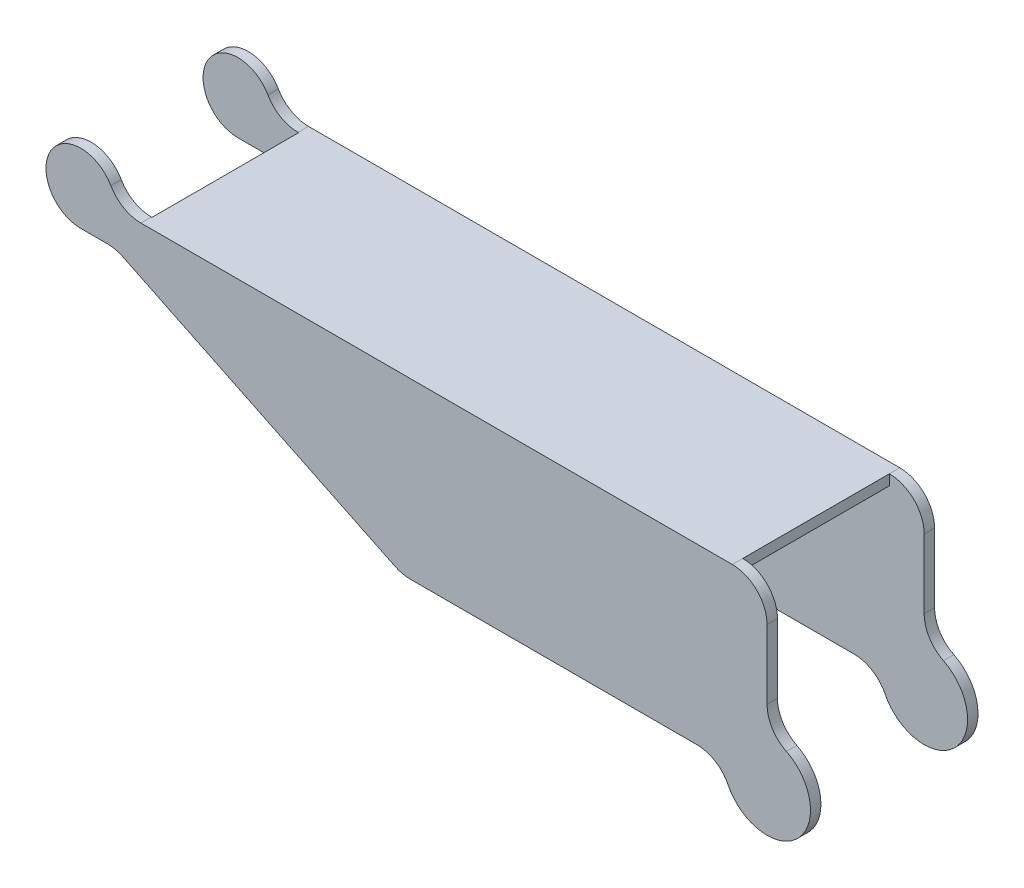
ISO-10303-21;
HEADER;
FILE_DESCRIPTION(('STEP AP214'),'2;1');
FILE_NAME('part.step','',(''),(''),'','','');
FILE_SCHEMA(('AUTOMOTIVE_DESIGN { 1 0 10303 214 1 1 1 1 }'));
ENDSEC;
DATA;
#1=APPLICATION_CONTEXT('core data for automotive mechanical design processes');
#2=APPLICATION_PROTOCOL_DEFINITION('international standard','automotive_design',2000,#1);
#3=PRODUCT_CONTEXT('',#1,'mechanical');
#4=PRODUCT('Part','Part','',(#3));
#5=PRODUCT_RELATED_PRODUCT_CATEGORY('part','',(#4));
#6=PRODUCT_DEFINITION_FORMATION('','',#4);
#7=PRODUCT_DEFINITION_CONTEXT('part definition',#1,'design');
#8=PRODUCT_DEFINITION('design','',#6,#7);
#9=PRODUCT_DEFINITION_SHAPE('','',#8);
#10=(LENGTH_UNIT() NAMED_UNIT(*) SI_UNIT(.MILLI.,.METRE.));
#11=(NAMED_UNIT(*) PLANE_ANGLE_UNIT() SI_UNIT($,.RADIAN.));
#12=(NAMED_UNIT(*) SI_UNIT($,.STERADIAN.) SOLID_ANGLE_UNIT());
#13=UNCERTAINTY_MEASURE_WITH_UNIT(LENGTH_MEASURE(1.E-05),#10,'distance_accuracy_value','');
#14=(GEOMETRIC_REPRESENTATION_CONTEXT(3) GLOBAL_UNCERTAINTY_ASSIGNED_CONTEXT((#13)) GLOBAL_UNIT_ASSIGNED_CONTEXT((#10,
#11,#12)) REPRESENTATION_CONTEXT('',''));
#15=CARTESIAN_POINT('',(0.,0.,0.));
#16=DIRECTION('',(0.,0.,1.));
#17=DIRECTION('',(1.,0.,0.));
#18=AXIS2_PLACEMENT_3D('',#15,#16,#17);
#19=CARTESIAN_POINT('',(78.5893556292536,-35.,3.));
#20=DIRECTION('',(0.,0.,-1.));
#21=DIRECTION('',(-1.,0.,0.));
#22=AXIS2_PLACEMENT_3D('',#19,#20,#21);
#23=CYLINDRICAL_SURFACE('',#22,10.);
#24=CARTESIAN_POINT('',(78.5893556292536,-35.,0.));
#25=DIRECTION('',(0.,0.,-1.));
#26=DIRECTION('',(-1.,0.,0.));
#27=AXIS2_PLACEMENT_3D('',#24,#25,#26);
#28=CIRCLE('',#27,10.);
#29=CARTESIAN_POINT('',(78.5893556292536,-25.,0.));
#30=VERTEX_POINT('',#29);
#31=CARTESIAN_POINT('',(87.5474197940298,-30.5555555555556,0.));
#32=VERTEX_POINT('',#31);
#33=EDGE_CURVE('E361',#30,#32,#28,.T.);
#34=ORIENTED_EDGE('',*,*,#33,.T.);
#35=DIRECTION('',(0.,0.,-1.));
#36=VECTOR('',#35,1.);
#37=CARTESIAN_POINT('',(87.5474197940298,-30.5555555555556,3.));
#38=LINE('',#37,#36);
#39=CARTESIAN_POINT('',(87.5474197940298,-30.5555555555556,3.));
#40=VERTEX_POINT('',#39);
#41=EDGE_CURVE('E457',#40,#32,#38,.T.);
#42=ORIENTED_EDGE('',*,*,#41,.F.);
#43=CARTESIAN_POINT('',(78.5893556292536,-35.,3.));
#44=DIRECTION('',(0.,0.,-1.));
#45=DIRECTION('',(-1.,0.,0.));
#46=AXIS2_PLACEMENT_3D('',#43,#44,#45);
#47=CIRCLE('',#46,10.);
#48=CARTESIAN_POINT('',(78.5893556292536,-25.,3.));
#49=VERTEX_POINT('',#48);
#50=EDGE_CURVE('E367',#49,#40,#47,.T.);
#51=ORIENTED_EDGE('',*,*,#50,.F.);
#52=DIRECTION('',(0.,0.,-1.));
#53=VECTOR('',#52,1.);
#54=CARTESIAN_POINT('',(78.5893556292536,-25.,3.));
#55=LINE('',#54,#53);
#56=EDGE_CURVE('E395',#49,#30,#55,.T.);
#57=ORIENTED_EDGE('',*,*,#56,.T.);
#58=EDGE_LOOP('',(#34,#42,#51,#57));
#59=FACE_BOUND('',#58,.T.);
#60=ADVANCED_FACE('F43',(#59),#23,.F.);
#61=CARTESIAN_POINT('',(98.745,-25.,3.));
#62=DIRECTION('',(0.,0.,-1.));
#63=DIRECTION('',(-1.,0.,0.));
#64=AXIS2_PLACEMENT_3D('',#61,#62,#63);
#65=CYLINDRICAL_SURFACE('',#64,12.5);
#66=CARTESIAN_POINT('',(98.745,-25.,0.));
#67=DIRECTION('',(0.,0.,1.));
#68=DIRECTION('',(1.,0.,0.));
#69=AXIS2_PLACEMENT_3D('',#66,#67,#68);
#70=CIRCLE('',#69,12.5);
#71=CARTESIAN_POINT('',(104.300555555556,-13.8024197940298,0.));
#72=VERTEX_POINT('',#71);
#73=EDGE_CURVE('E398',#32,#72,#70,.T.);
#74=ORIENTED_EDGE('',*,*,#73,.T.);
#75=DIRECTION('',(0.,0.,-1.));
#76=VECTOR('',#75,1.);
#77=CARTESIAN_POINT('',(104.300555555556,-13.8024197940298,3.));
#78=LINE('',#77,#76);
#79=CARTESIAN_POINT('',(104.300555555556,-13.8024197940298,3.));
#80=VERTEX_POINT('',#79);
#81=EDGE_CURVE('E454',#80,#72,#78,.T.);
#82=ORIENTED_EDGE('',*,*,#81,.F.);
#83=CARTESIAN_POINT('',(98.745,-25.,3.));
#84=DIRECTION('',(0.,0.,1.));
#85=DIRECTION('',(1.,0.,0.));
#86=AXIS2_PLACEMENT_3D('',#83,#84,#85);
#87=CIRCLE('',#86,12.5);
#88=EDGE_CURVE('E370',#40,#80,#87,.T.);
#89=ORIENTED_EDGE('',*,*,#88,.F.);
#90=ORIENTED_EDGE('',*,*,#41,.T.);
#91=EDGE_LOOP('',(#74,#82,#89,#90));
#92=FACE_BOUND('',#91,.T.);
#93=ADVANCED_FACE('F533',(#92),#65,.T.);
#94=CARTESIAN_POINT('',(108.745,-4.84435562925363,3.));
#95=DIRECTION('',(0.,0.,-1.));
#96=DIRECTION('',(-1.,0.,0.));
#97=AXIS2_PLACEMENT_3D('',#94,#95,#96);
#98=CYLINDRICAL_SURFACE('',#97,10.);
#99=CARTESIAN_POINT('',(108.745,-4.84435562925363,0.));
#100=DIRECTION('',(0.,0.,-1.));
#101=DIRECTION('',(-1.,0.,0.));
#102=AXIS2_PLACEMENT_3D('',#99,#100,#101);
#103=CIRCLE('',#102,10.);
#104=CARTESIAN_POINT('',(98.745,-4.84435562925363,0.));
#105=VERTEX_POINT('',#104);
#106=EDGE_CURVE('E400',#72,#105,#103,.T.);
#107=ORIENTED_EDGE('',*,*,#106,.T.);
#108=DIRECTION('',(0.,0.,-1.));
#109=VECTOR('',#108,1.);
#110=CARTESIAN_POINT('',(98.745,-4.84435562925363,3.));
#111=LINE('',#110,#109);
#112=CARTESIAN_POINT('',(98.745,-4.84435562925363,3.));
#113=VERTEX_POINT('',#112);
#114=EDGE_CURVE('E451',#113,#105,#111,.T.);
#115=ORIENTED_EDGE('',*,*,#114,.F.);
#116=CARTESIAN_POINT('',(108.745,-4.84435562925363,3.));
#117=DIRECTION('',(0.,0.,-1.));
#118=DIRECTION('',(-1.,0.,0.));
#119=AXIS2_PLACEMENT_3D('',#116,#117,#118);
#120=CIRCLE('',#119,10.);
#121=EDGE_CURVE('E373',#80,#113,#120,.T.);
#122=ORIENTED_EDGE('',*,*,#121,.F.);
#123=ORIENTED_EDGE('',*,*,#81,.T.);
#124=EDGE_LOOP('',(#107,#115,#122,#123));
#125=FACE_BOUND('',#124,.T.);
#126=ADVANCED_FACE('F530',(#125),#98,.F.);
#127=CARTESIAN_POINT('',(98.745,-4.84435562925363,3.));
#128=DIRECTION('',(-1.,0.,0.));
#129=DIRECTION('',(0.,0.,1.));
#130=AXIS2_PLACEMENT_3D('',#127,#128,#129);
#131=PLANE('',#130);
#132=DIRECTION('',(0.,1.,0.));
#133=VECTOR('',#132,1.);
#134=CARTESIAN_POINT('',(98.745,-4.84435562925363,0.));
#135=LINE('',#134,#133);
#136=CARTESIAN_POINT('',(98.745,14.9999999999999,0.));
#137=VERTEX_POINT('',#136);
#138=EDGE_CURVE('E402',#105,#137,#135,.T.);
#139=ORIENTED_EDGE('',*,*,#138,.T.);
#140=DIRECTION('',(0.,0.,-1.));
#141=VECTOR('',#140,1.);
#142=CARTESIAN_POINT('',(98.745,14.9999999999999,3.));
#143=LINE('',#142,#141);
#144=CARTESIAN_POINT('',(98.745,14.9999999999999,3.));
#145=VERTEX_POINT('',#144);
#146=EDGE_CURVE('E448',#145,#137,#143,.T.);
#147=ORIENTED_EDGE('',*,*,#146,.F.);
#148=DIRECTION('',(0.,1.,0.));
#149=VECTOR('',#148,1.);
#150=CARTESIAN_POINT('',(98.745,-4.84435562925363,3.));
#151=LINE('',#150,#149);
#152=EDGE_CURVE('E375',#113,#145,#151,.T.);
#153=ORIENTED_EDGE('',*,*,#152,.F.);
#154=ORIENTED_EDGE('',*,*,#114,.T.);
#155=EDGE_LOOP('',(#139,#147,#153,#154));
#156=FACE_BOUND('',#155,.T.);
#157=ADVANCED_FACE('F525',(#156),#131,.F.);
#158=CARTESIAN_POINT('',(88.745,15.,3.));
#159=DIRECTION('',(0.,0.,-1.));
#160=DIRECTION('',(-1.,0.,0.));
#161=AXIS2_PLACEMENT_3D('',#158,#159,#160);
#162=CYLINDRICAL_SURFACE('',#161,10.);
#163=CARTESIAN_POINT('',(88.745,15.,0.));
#164=DIRECTION('',(0.,0.,1.));
#165=DIRECTION('',(-1.,0.,0.));
#166=AXIS2_PLACEMENT_3D('',#163,#164,#165);
#167=CIRCLE('',#166,10.);
#168=CARTESIAN_POINT('',(88.7449999999999,25.,0.));
#169=VERTEX_POINT('',#168);
#170=EDGE_CURVE('E404',#137,#169,#167,.T.);
#171=ORIENTED_EDGE('',*,*,#170,.T.);
#172=DIRECTION('',(0.,0.,-1.));
#173=VECTOR('',#172,1.);
#174=CARTESIAN_POINT('',(88.7449999999999,25.,3.));
#175=LINE('',#174,#173);
#176=CARTESIAN_POINT('',(88.7449999999999,25.,3.));
#177=VERTEX_POINT('',#176);
#178=EDGE_CURVE('E445',#177,#169,#175,.T.);
#179=ORIENTED_EDGE('',*,*,#178,.F.);
#180=CARTESIAN_POINT('',(88.745,15.,3.));
#181=DIRECTION('',(0.,0.,1.));
#182=DIRECTION('',(-1.,0.,0.));
#183=AXIS2_PLACEMENT_3D('',#180,#181,#182);
#184=CIRCLE('',#183,10.);
#185=EDGE_CURVE('E377',#145,#177,#184,.T.);
#186=ORIENTED_EDGE('',*,*,#185,.F.);
#187=ORIENTED_EDGE('',*,*,#146,.T.);
#188=EDGE_LOOP('',(#171,#179,#186,#187));
#189=FACE_BOUND('',#188,.T.);
#190=ADVANCED_FACE('F520',(#189),#162,.T.);
#191=CARTESIAN_POINT('',(-81.4244919243112,25.,3.));
#192=DIRECTION('',(0.,-1.,0.));
#193=DIRECTION('',(0.,0.,-1.));
#194=AXIS2_PLACEMENT_3D('',#191,#192,#193);
#195=PLANE('',#194);
#196=DIRECTION('',(0.,0.,-1.));
#197=VECTOR('',#196,1.);
#198=CARTESIAN_POINT('',(88.7449999999999,25.,-45.2));
#199=LINE('',#198,#197);
#200=CARTESIAN_POINT('',(88.7449999999999,25.,-42.2));
#201=VERTEX_POINT('',#200);
#202=EDGE_CURVE('E355',#169,#201,#199,.T.);
#203=ORIENTED_EDGE('',*,*,#202,.T.);
#204=DIRECTION('',(0.,0.,1.));
#205=VECTOR('',#204,1.);
#206=CARTESIAN_POINT('',(88.7449999999999,25.,-45.2));
#207=LINE('',#206,#205);
#208=CARTESIAN_POINT('',(88.7449999999999,25.,-45.2));
#209=VERTEX_POINT('',#208);
#210=EDGE_CURVE('E344',#209,#201,#207,.T.);
#211=ORIENTED_EDGE('',*,*,#210,.F.);
#212=DIRECTION('',(-1.,0.,0.));
#213=VECTOR('',#212,1.);
#214=CARTESIAN_POINT('',(-81.2550000000001,25.,-45.2));
#215=LINE('',#214,#213);
#216=CARTESIAN_POINT('',(-81.4244919243112,25.,-45.2));
#217=VERTEX_POINT('',#216);
#218=EDGE_CURVE('E364',#209,#217,#215,.T.);
#219=ORIENTED_EDGE('',*,*,#218,.T.);
#220=DIRECTION('',(0.,0.,1.));
#221=VECTOR('',#220,1.);
#222=CARTESIAN_POINT('',(-81.4244919243112,25.,-45.2));
#223=LINE('',#222,#221);
#224=CARTESIAN_POINT('',(-81.4244919243112,25.,-42.2));
#225=VERTEX_POINT('',#224);
#226=EDGE_CURVE('E341',#217,#225,#223,.T.);
#227=ORIENTED_EDGE('',*,*,#226,.T.);
#228=DIRECTION('',(-1.,0.,0.));
#229=VECTOR('',#228,1.);
#230=CARTESIAN_POINT('',(-81.4244919243112,25.,-42.2));
#231=LINE('',#230,#229);
#232=CARTESIAN_POINT('',(-81.2550000000001,25.,-42.2));
#233=VERTEX_POINT('',#232);
#234=EDGE_CURVE('E303',#233,#225,#231,.T.);
#235=ORIENTED_EDGE('',*,*,#234,.F.);
#236=DIRECTION('',(0.,0.,1.));
#237=VECTOR('',#236,1.);
#238=CARTESIAN_POINT('',(-81.2550000000001,25.,-45.2));
#239=LINE('',#238,#237);
#240=CARTESIAN_POINT('',(-81.2550000000001,25.,0.));
#241=VERTEX_POINT('',#240);
#242=EDGE_CURVE('E64',#233,#241,#239,.T.);
#243=ORIENTED_EDGE('',*,*,#242,.T.);
#244=DIRECTION('',(-1.,0.,0.));
#245=VECTOR('',#244,1.);
#246=CARTESIAN_POINT('',(-81.4244919243112,25.,0.));
#247=LINE('',#246,#245);
#248=CARTESIAN_POINT('',(-81.4244919243112,25.,0.));
#249=VERTEX_POINT('',#248);
#250=EDGE_CURVE('E407',#241,#249,#247,.T.);
#251=ORIENTED_EDGE('',*,*,#250,.T.);
#252=DIRECTION('',(0.,0.,-1.));
#253=VECTOR('',#252,1.);
#254=CARTESIAN_POINT('',(-81.4244919243112,25.,3.));
#255=LINE('',#254,#253);
#256=CARTESIAN_POINT('',(-81.4244919243112,25.,3.));
#257=VERTEX_POINT('',#256);
#258=EDGE_CURVE('E442',#257,#249,#255,.T.);
#259=ORIENTED_EDGE('',*,*,#258,.F.);
#260=DIRECTION('',(-1.,0.,0.));
#261=VECTOR('',#260,1.);
#262=CARTESIAN_POINT('',(-81.4244919243112,25.,3.));
#263=LINE('',#262,#261);
#264=EDGE_CURVE('E379',#177,#257,#263,.T.);
#265=ORIENTED_EDGE('',*,*,#264,.F.);
#266=ORIENTED_EDGE('',*,*,#178,.T.);
#267=EDGE_LOOP('',(#203,#211,#219,#227,#235,#243,#251,#259,#265,#266));
#268=FACE_BOUND('',#267,.T.);
#269=ADVANCED_FACE('F483',(#268),#195,.F.);
#270=CARTESIAN_POINT('',(-81.4244919243112,35.,3.));
#271=DIRECTION('',(0.,0.,-1.));
#272=DIRECTION('',(-1.,0.,0.));
#273=AXIS2_PLACEMENT_3D('',#270,#271,#272);
#274=CYLINDRICAL_SURFACE('',#273,10.);
#275=CARTESIAN_POINT('',(-81.4244919243112,35.,0.));
#276=DIRECTION('',(0.,0.,-1.));
#277=DIRECTION('',(-1.,0.,0.));
#278=AXIS2_PLACEMENT_3D('',#275,#276,#277);
#279=CIRCLE('',#278,10.);
#280=CARTESIAN_POINT('',(-90.0847459621556,30.,0.));
#281=VERTEX_POINT('',#280);
#282=EDGE_CURVE('E409',#249,#281,#279,.T.);
#283=ORIENTED_EDGE('',*,*,#282,.T.);
#284=DIRECTION('',(0.,0.,-1.));
#285=VECTOR('',#284,1.);
#286=CARTESIAN_POINT('',(-90.0847459621556,30.,3.));
#287=LINE('',#286,#285);
#288=CARTESIAN_POINT('',(-90.0847459621556,30.,3.));
#289=VERTEX_POINT('',#288);
#290=EDGE_CURVE('E439',#289,#281,#287,.T.);
#291=ORIENTED_EDGE('',*,*,#290,.F.);
#292=CARTESIAN_POINT('',(-81.4244919243112,35.,3.));
#293=DIRECTION('',(0.,0.,-1.));
#294=DIRECTION('',(-1.,0.,0.));
#295=AXIS2_PLACEMENT_3D('',#292,#293,#294);
#296=CIRCLE('',#295,10.);
#297=EDGE_CURVE('E381',#257,#289,#296,.T.);
#298=ORIENTED_EDGE('',*,*,#297,.F.);
#299=ORIENTED_EDGE('',*,*,#258,.T.);
#300=EDGE_LOOP('',(#283,#291,#298,#299));
#301=FACE_BOUND('',#300,.T.);
#302=ADVANCED_FACE('F571',(#301),#274,.F.);
#303=CARTESIAN_POINT('',(-98.745,25.,3.));
#304=DIRECTION('',(0.,0.,-1.));
#305=DIRECTION('',(-1.,0.,0.));
#306=AXIS2_PLACEMENT_3D('',#303,#304,#305);
#307=CYLINDRICAL_SURFACE('',#306,9.99999999999999);
#308=CARTESIAN_POINT('',(-98.745,25.,0.));
#309=DIRECTION('',(0.,0.,1.));
#310=DIRECTION('',(1.,0.,0.));
#311=AXIS2_PLACEMENT_3D('',#308,#309,#310);
#312=CIRCLE('',#311,9.99999999999999);
#313=CARTESIAN_POINT('',(-98.745,15.,0.));
#314=VERTEX_POINT('',#313);
#315=EDGE_CURVE('E411',#281,#314,#312,.T.);
#316=ORIENTED_EDGE('',*,*,#315,.T.);
#317=DIRECTION('',(0.,0.,-1.));
#318=VECTOR('',#317,1.);
#319=CARTESIAN_POINT('',(-98.745,15.,3.));
#320=LINE('',#319,#318);
#321=CARTESIAN_POINT('',(-98.745,15.,3.));
#322=VERTEX_POINT('',#321);
#323=EDGE_CURVE('E436',#322,#314,#320,.T.);
#324=ORIENTED_EDGE('',*,*,#323,.F.);
#325=CARTESIAN_POINT('',(-98.745,25.,3.));
#326=DIRECTION('',(0.,0.,1.));
#327=DIRECTION('',(1.,0.,0.));
#328=AXIS2_PLACEMENT_3D('',#325,#326,#327);
#329=CIRCLE('',#328,9.99999999999999);
#330=EDGE_CURVE('E383',#289,#322,#329,.T.);
#331=ORIENTED_EDGE('',*,*,#330,.F.);
#332=ORIENTED_EDGE('',*,*,#290,.T.);
#333=EDGE_LOOP('',(#316,#324,#331,#332));
#334=FACE_BOUND('',#333,.T.);
#335=ADVANCED_FACE('F566',(#334),#307,.T.);
#336=CARTESIAN_POINT('',(-98.745,15.,3.));
#337=DIRECTION('',(0.,1.,0.));
#338=DIRECTION('',(0.,0.,1.));
#339=AXIS2_PLACEMENT_3D('',#336,#337,#338);
#340=PLANE('',#339);
#341=DIRECTION('',(1.,0.,0.));
#342=VECTOR('',#341,1.);
#343=CARTESIAN_POINT('',(-98.745,15.,0.));
#344=LINE('',#343,#342);
#345=CARTESIAN_POINT('',(-91.041526264969,15.,0.));
#346=VERTEX_POINT('',#345);
#347=EDGE_CURVE('E413',#314,#346,#344,.T.);
#348=ORIENTED_EDGE('',*,*,#347,.T.);
#349=DIRECTION('',(0.,0.,-1.));
#350=VECTOR('',#349,1.);
#351=CARTESIAN_POINT('',(-91.041526264969,15.,3.));
#352=LINE('',#351,#350);
#353=CARTESIAN_POINT('',(-91.041526264969,15.,3.));
#354=VERTEX_POINT('',#353);
#355=EDGE_CURVE('E433',#354,#346,#352,.T.);
#356=ORIENTED_EDGE('',*,*,#355,.F.);
#357=DIRECTION('',(1.,0.,0.));
#358=VECTOR('',#357,1.);
#359=CARTESIAN_POINT('',(-98.745,15.,3.));
#360=LINE('',#359,#358);
#361=EDGE_CURVE('E385',#322,#354,#360,.T.);
#362=ORIENTED_EDGE('',*,*,#361,.F.);
#363=ORIENTED_EDGE('',*,*,#323,.T.);
#364=EDGE_LOOP('',(#348,#356,#362,#363));
#365=FACE_BOUND('',#364,.T.);
#366=ADVANCED_FACE('F562',(#365),#340,.F.);
#367=CARTESIAN_POINT('',(-91.041526264969,5.,3.));
#368=DIRECTION('',(0.,0.,-1.));
#369=DIRECTION('',(-1.,0.,0.));
#370=AXIS2_PLACEMENT_3D('',#367,#368,#369);
#371=CYLINDRICAL_SURFACE('',#370,10.);
#372=CARTESIAN_POINT('',(-91.041526264969,5.,0.));
#373=DIRECTION('',(0.,0.,-1.));
#374=DIRECTION('',(-1.,0.,0.));
#375=AXIS2_PLACEMENT_3D('',#372,#373,#374);
#376=CIRCLE('',#375,10.);
#377=CARTESIAN_POINT('',(-86.6785771083378,13.9980372669072,0.));
#378=VERTEX_POINT('',#377);
#379=EDGE_CURVE('E415',#346,#378,#376,.T.);
#380=ORIENTED_EDGE('',*,*,#379,.T.);
#381=DIRECTION('',(0.,0.,-1.));
#382=VECTOR('',#381,1.);
#383=CARTESIAN_POINT('',(-86.6785771083378,13.9980372669072,3.));
#384=LINE('',#383,#382);
#385=CARTESIAN_POINT('',(-86.6785771083378,13.9980372669072,3.));
#386=VERTEX_POINT('',#385);
#387=EDGE_CURVE('E430',#386,#378,#384,.T.);
#388=ORIENTED_EDGE('',*,*,#387,.F.);
#389=CARTESIAN_POINT('',(-91.041526264969,5.,3.));
#390=DIRECTION('',(0.,0.,-1.));
#391=DIRECTION('',(-1.,0.,0.));
#392=AXIS2_PLACEMENT_3D('',#389,#390,#391);
#393=CIRCLE('',#392,10.);
#394=EDGE_CURVE('E387',#354,#386,#393,.T.);
#395=ORIENTED_EDGE('',*,*,#394,.F.);
#396=ORIENTED_EDGE('',*,*,#355,.T.);
#397=EDGE_LOOP('',(#380,#388,#395,#396));
#398=FACE_BOUND('',#397,.T.);
#399=ADVANCED_FACE('F558',(#398),#371,.F.);
#400=CARTESIAN_POINT('',(-86.6785771083378,13.9980372669072,3.));
#401=DIRECTION('',(0.436294915663118,0.899803726690723,0.));
#402=DIRECTION('',(-0.899803726690723,0.436294915663118,0.));
#403=AXIS2_PLACEMENT_3D('',#400,#401,#402);
#404=PLANE('',#403);
#405=DIRECTION('',(0.899803726690723,-0.436294915663118,0.));
#406=VECTOR('',#405,1.);
#407=CARTESIAN_POINT('',(-86.6785771083378,13.9980372669072,0.));
#408=LINE('',#407,#406);
#409=CARTESIAN_POINT('',(-8.31642289166227,-23.9980372669072,0.));
#410=VERTEX_POINT('',#409);
#411=EDGE_CURVE('E417',#378,#410,#408,.T.);
#412=ORIENTED_EDGE('',*,*,#411,.T.);
#413=DIRECTION('',(0.,0.,-1.));
#414=VECTOR('',#413,1.);
#415=CARTESIAN_POINT('',(-8.31642289166227,-23.9980372669072,3.));
#416=LINE('',#415,#414);
#417=CARTESIAN_POINT('',(-8.31642289166227,-23.9980372669072,3.));
#418=VERTEX_POINT('',#417);
#419=EDGE_CURVE('E427',#418,#410,#416,.T.);
#420=ORIENTED_EDGE('',*,*,#419,.F.);
#421=DIRECTION('',(0.899803726690723,-0.436294915663118,0.));
#422=VECTOR('',#421,1.);
#423=CARTESIAN_POINT('',(-86.6785771083378,13.9980372669072,3.));
#424=LINE('',#423,#422);
#425=EDGE_CURVE('E389',#386,#418,#424,.T.);
#426=ORIENTED_EDGE('',*,*,#425,.F.);
#427=ORIENTED_EDGE('',*,*,#387,.T.);
#428=EDGE_LOOP('',(#412,#420,#426,#427));
#429=FACE_BOUND('',#428,.T.);
#430=ADVANCED_FACE('F553',(#429),#404,.F.);
#431=CARTESIAN_POINT('',(-3.95347373503106,-15.,3.));
#432=DIRECTION('',(0.,0.,-1.));
#433=DIRECTION('',(-1.,0.,0.));
#434=AXIS2_PLACEMENT_3D('',#431,#432,#433);
#435=CYLINDRICAL_SURFACE('',#434,10.);
#436=CARTESIAN_POINT('',(-3.95347373503106,-15.,0.));
#437=DIRECTION('',(0.,0.,1.));
#438=DIRECTION('',(1.,0.,0.));
#439=AXIS2_PLACEMENT_3D('',#436,#437,#438);
#440=CIRCLE('',#439,10.);
#441=CARTESIAN_POINT('',(-3.95347373503102,-25.,0.));
#442=VERTEX_POINT('',#441);
#443=EDGE_CURVE('E419',#410,#442,#440,.T.);
#444=ORIENTED_EDGE('',*,*,#443,.T.);
#445=DIRECTION('',(0.,0.,-1.));
#446=VECTOR('',#445,1.);
#447=CARTESIAN_POINT('',(-3.95347373503102,-25.,3.));
#448=LINE('',#447,#446);
#449=CARTESIAN_POINT('',(-3.95347373503102,-25.,3.));
#450=VERTEX_POINT('',#449);
#451=EDGE_CURVE('E424',#450,#442,#448,.T.);
#452=ORIENTED_EDGE('',*,*,#451,.F.);
#453=CARTESIAN_POINT('',(-3.95347373503106,-15.,3.));
#454=DIRECTION('',(0.,0.,1.));
#455=DIRECTION('',(1.,0.,0.));
#456=AXIS2_PLACEMENT_3D('',#453,#454,#455);
#457=CIRCLE('',#456,10.);
#458=EDGE_CURVE('E391',#418,#450,#457,.T.);
#459=ORIENTED_EDGE('',*,*,#458,.F.);
#460=ORIENTED_EDGE('',*,*,#419,.T.);
#461=EDGE_LOOP('',(#444,#452,#459,#460));
#462=FACE_BOUND('',#461,.T.);
#463=ADVANCED_FACE('F547',(#462),#435,.T.);
#464=CARTESIAN_POINT('',(-3.95347373503102,-25.,3.));
#465=DIRECTION('',(0.,1.,0.));
#466=DIRECTION('',(0.,0.,1.));
#467=AXIS2_PLACEMENT_3D('',#464,#465,#466);
#468=PLANE('',#467);
#469=DIRECTION('',(1.,0.,0.));
#470=VECTOR('',#469,1.);
#471=CARTESIAN_POINT('',(-3.95347373503102,-25.,0.));
#472=LINE('',#471,#470);
#473=EDGE_CURVE('E371',#442,#30,#472,.T.);
#474=ORIENTED_EDGE('',*,*,#473,.T.);
#475=ORIENTED_EDGE('',*,*,#56,.F.);
#476=DIRECTION('',(1.,0.,0.));
#477=VECTOR('',#476,1.);
#478=CARTESIAN_POINT('',(-3.95347373503102,-25.,3.));
#479=LINE('',#478,#477);
#480=EDGE_CURVE('E393',#450,#49,#479,.T.);
#481=ORIENTED_EDGE('',*,*,#480,.F.);
#482=ORIENTED_EDGE('',*,*,#451,.T.);
#483=EDGE_LOOP('',(#474,#475,#481,#482));
#484=FACE_BOUND('',#483,.T.);
#485=ADVANCED_FACE('F543',(#484),#468,.F.);
#486=CARTESIAN_POINT('',(78.5893556292536,-35.,3.));
#487=DIRECTION('',(0.,0.,-1.));
#488=DIRECTION('',(-1.,0.,0.));
#489=AXIS2_PLACEMENT_3D('',#486,#487,#488);
#490=PLANE('',#489);
#491=ORIENTED_EDGE('',*,*,#264,.T.);
#492=ORIENTED_EDGE('',*,*,#297,.T.);
#493=ORIENTED_EDGE('',*,*,#330,.T.);
#494=ORIENTED_EDGE('',*,*,#361,.T.);
#495=ORIENTED_EDGE('',*,*,#394,.T.);
#496=ORIENTED_EDGE('',*,*,#425,.T.);
#497=ORIENTED_EDGE('',*,*,#458,.T.);
#498=ORIENTED_EDGE('',*,*,#480,.T.);
#499=ORIENTED_EDGE('',*,*,#50,.T.);
#500=ORIENTED_EDGE('',*,*,#88,.T.);
#501=ORIENTED_EDGE('',*,*,#121,.T.);
#502=ORIENTED_EDGE('',*,*,#152,.T.);
#503=ORIENTED_EDGE('',*,*,#185,.T.);
#504=EDGE_LOOP('',(#491,#492,#493,#494,#495,#496,#497,#498,#499,#500,#501,#502,#503));
#505=FACE_BOUND('',#504,.T.);
#506=ADVANCED_FACE('F573',(#505),#490,.F.);
#507=CARTESIAN_POINT('',(78.5893556292536,-35.,0.));
#508=DIRECTION('',(0.,0.,-1.));
#509=DIRECTION('',(-1.,0.,0.));
#510=AXIS2_PLACEMENT_3D('',#507,#508,#509);
#511=PLANE('',#510);
#512=DIRECTION('',(0.,-1.,0.));
#513=VECTOR('',#512,1.);
#514=CARTESIAN_POINT('',(88.7449999999999,-35.,0.));
#515=LINE('',#514,#513);
#516=CARTESIAN_POINT('',(88.7449999999999,22.,0.));
#517=VERTEX_POINT('',#516);
#518=EDGE_CURVE('E50',#169,#517,#515,.T.);
#519=ORIENTED_EDGE('',*,*,#518,.F.);
#520=ORIENTED_EDGE('',*,*,#170,.F.);
#521=ORIENTED_EDGE('',*,*,#138,.F.);
#522=ORIENTED_EDGE('',*,*,#106,.F.);
#523=ORIENTED_EDGE('',*,*,#73,.F.);
#524=ORIENTED_EDGE('',*,*,#33,.F.);
#525=ORIENTED_EDGE('',*,*,#473,.F.);
#526=ORIENTED_EDGE('',*,*,#443,.F.);
#527=ORIENTED_EDGE('',*,*,#411,.F.);
#528=ORIENTED_EDGE('',*,*,#379,.F.);
#529=ORIENTED_EDGE('',*,*,#347,.F.);
#530=ORIENTED_EDGE('',*,*,#315,.F.);
#531=ORIENTED_EDGE('',*,*,#282,.F.);
#532=ORIENTED_EDGE('',*,*,#250,.F.);
#533=DIRECTION('',(0.,1.,0.));
#534=VECTOR('',#533,1.);
#535=CARTESIAN_POINT('',(-81.2550000000001,-35.,0.));
#536=LINE('',#535,#534);
#537=CARTESIAN_POINT('',(-81.2550000000001,22.,0.));
#538=VERTEX_POINT('',#537);
#539=EDGE_CURVE('E463',#538,#241,#536,.T.);
#540=ORIENTED_EDGE('',*,*,#539,.F.);
#541=DIRECTION('',(1.,0.,0.));
#542=VECTOR('',#541,1.);
#543=CARTESIAN_POINT('',(78.5893556292536,22.,0.));
#544=LINE('',#543,#542);
#545=EDGE_CURVE('E460',#538,#517,#544,.T.);
#546=ORIENTED_EDGE('',*,*,#545,.T.);
#547=EDGE_LOOP('',(#519,#520,#521,#522,#523,#524,#525,#526,#527,#528,#529,#530,#531,#532,#540,#546));
#548=FACE_BOUND('',#547,.T.);
#549=ADVANCED_FACE('F475',(#548),#511,.T.);
#550=CARTESIAN_POINT('',(88.7449999999999,22.,-45.2));
#551=DIRECTION('',(1.,0.,0.));
#552=DIRECTION('',(0.,0.,-1.));
#553=AXIS2_PLACEMENT_3D('',#550,#551,#552);
#554=PLANE('',#553);
#555=DIRECTION('',(0.,-1.,0.));
#556=VECTOR('',#555,1.);
#557=CARTESIAN_POINT('',(88.7449999999999,22.,-42.2));
#558=LINE('',#557,#556);
#559=CARTESIAN_POINT('',(88.7449999999999,22.,-42.2));
#560=VERTEX_POINT('',#559);
#561=EDGE_CURVE('E57',#201,#560,#558,.T.);
#562=ORIENTED_EDGE('',*,*,#561,.F.);
#563=ORIENTED_EDGE('',*,*,#202,.F.);
#564=ORIENTED_EDGE('',*,*,#518,.T.);
#565=DIRECTION('',(0.,0.,-1.));
#566=VECTOR('',#565,1.);
#567=CARTESIAN_POINT('',(88.7449999999999,22.,-45.2));
#568=LINE('',#567,#566);
#569=EDGE_CURVE('E356',#517,#560,#568,.T.);
#570=ORIENTED_EDGE('',*,*,#569,.T.);
#571=EDGE_LOOP('',(#562,#563,#564,#570));
#572=FACE_BOUND('',#571,.T.);
#573=ADVANCED_FACE('F467',(#572),#554,.T.);
#574=CARTESIAN_POINT('',(-81.2550000000001,22.,-45.2));
#575=DIRECTION('',(-1.,0.,0.));
#576=DIRECTION('',(0.,0.,1.));
#577=AXIS2_PLACEMENT_3D('',#574,#575,#576);
#578=PLANE('',#577);
#579=DIRECTION('',(0.,1.,0.));
#580=VECTOR('',#579,1.);
#581=CARTESIAN_POINT('',(-81.2550000000001,22.,-42.2));
#582=LINE('',#581,#580);
#583=CARTESIAN_POINT('',(-81.2550000000001,22.,-42.2));
#584=VERTEX_POINT('',#583);
#585=EDGE_CURVE('E255',#584,#233,#582,.T.);
#586=ORIENTED_EDGE('',*,*,#585,.F.);
#587=DIRECTION('',(0.,0.,1.));
#588=VECTOR('',#587,1.);
#589=CARTESIAN_POINT('',(-81.2550000000001,22.,-45.2));
#590=LINE('',#589,#588);
#591=EDGE_CURVE('E359',#584,#538,#590,.T.);
#592=ORIENTED_EDGE('',*,*,#591,.T.);
#593=ORIENTED_EDGE('',*,*,#539,.T.);
#594=ORIENTED_EDGE('',*,*,#242,.F.);
#595=EDGE_LOOP('',(#586,#592,#593,#594));
#596=FACE_BOUND('',#595,.T.);
#597=ADVANCED_FACE('F480',(#596),#578,.T.);
#598=CARTESIAN_POINT('',(-81.2550000000001,22.,-45.2));
#599=DIRECTION('',(0.,0.,-1.));
#600=DIRECTION('',(-1.,0.,0.));
#601=AXIS2_PLACEMENT_3D('',#598,#599,#600);
#602=PLANE('',#601);
#603=ORIENTED_EDGE('',*,*,#218,.F.);
#604=CARTESIAN_POINT('',(88.745,15.,-45.2));
#605=DIRECTION('',(0.,0.,1.));
#606=DIRECTION('',(-1.,0.,0.));
#607=AXIS2_PLACEMENT_3D('',#604,#605,#606);
#608=CIRCLE('',#607,10.);
#609=CARTESIAN_POINT('',(98.745,14.9999999999999,-45.2));
#610=VERTEX_POINT('',#609);
#611=EDGE_CURVE('E270',#610,#209,#608,.T.);
#612=ORIENTED_EDGE('',*,*,#611,.F.);
#613=DIRECTION('',(0.,1.,0.));
#614=VECTOR('',#613,1.);
#615=CARTESIAN_POINT('',(98.745,-4.84435562925363,-45.2));
#616=LINE('',#615,#614);
#617=CARTESIAN_POINT('',(98.745,-4.84435562925363,-45.2));
#618=VERTEX_POINT('',#617);
#619=EDGE_CURVE('E267',#618,#610,#616,.T.);
#620=ORIENTED_EDGE('',*,*,#619,.F.);
#621=CARTESIAN_POINT('',(108.745,-4.84435562925363,-45.2));
#622=DIRECTION('',(0.,0.,-1.));
#623=DIRECTION('',(-1.,0.,0.));
#624=AXIS2_PLACEMENT_3D('',#621,#622,#623);
#625=CIRCLE('',#624,10.);
#626=CARTESIAN_POINT('',(104.300555555556,-13.8024197940298,-45.2));
#627=VERTEX_POINT('',#626);
#628=EDGE_CURVE('E242',#627,#618,#625,.T.);
#629=ORIENTED_EDGE('',*,*,#628,.F.);
#630=CARTESIAN_POINT('',(98.745,-25.,-45.2));
#631=DIRECTION('',(0.,0.,1.));
#632=DIRECTION('',(1.,0.,0.));
#633=AXIS2_PLACEMENT_3D('',#630,#631,#632);
#634=CIRCLE('',#633,12.5);
#635=CARTESIAN_POINT('',(87.5474197940298,-30.5555555555556,-45.2));
#636=VERTEX_POINT('',#635);
#637=EDGE_CURVE('E234',#636,#627,#634,.T.);
#638=ORIENTED_EDGE('',*,*,#637,.F.);
#639=CARTESIAN_POINT('',(78.5893556292536,-35.,-45.2));
#640=DIRECTION('',(0.,0.,-1.));
#641=DIRECTION('',(-1.,0.,0.));
#642=AXIS2_PLACEMENT_3D('',#639,#640,#641);
#643=CIRCLE('',#642,10.);
#644=CARTESIAN_POINT('',(78.5893556292536,-25.,-45.2));
#645=VERTEX_POINT('',#644);
#646=EDGE_CURVE('E239',#645,#636,#643,.T.);
#647=ORIENTED_EDGE('',*,*,#646,.F.);
#648=DIRECTION('',(1.,0.,0.));
#649=VECTOR('',#648,1.);
#650=CARTESIAN_POINT('',(-3.95347373503102,-25.,-45.2));
#651=LINE('',#650,#649);
#652=CARTESIAN_POINT('',(-3.95347373503102,-25.,-45.2));
#653=VERTEX_POINT('',#652);
#654=EDGE_CURVE('E290',#653,#645,#651,.T.);
#655=ORIENTED_EDGE('',*,*,#654,.F.);
#656=CARTESIAN_POINT('',(-3.95347373503106,-15.,-45.2));
#657=DIRECTION('',(0.,0.,1.));
#658=DIRECTION('',(1.,0.,0.));
#659=AXIS2_PLACEMENT_3D('',#656,#657,#658);
#660=CIRCLE('',#659,10.);
#661=CARTESIAN_POINT('',(-8.31642289166227,-23.9980372669072,-45.2));
#662=VERTEX_POINT('',#661);
#663=EDGE_CURVE('E287',#662,#653,#660,.T.);
#664=ORIENTED_EDGE('',*,*,#663,.F.);
#665=DIRECTION('',(0.899803726690723,-0.436294915663118,0.));
#666=VECTOR('',#665,1.);
#667=CARTESIAN_POINT('',(-86.6785771083378,13.9980372669072,-45.2));
#668=LINE('',#667,#666);
#669=CARTESIAN_POINT('',(-86.6785771083378,13.9980372669072,-45.2));
#670=VERTEX_POINT('',#669);
#671=EDGE_CURVE('E284',#670,#662,#668,.T.);
#672=ORIENTED_EDGE('',*,*,#671,.F.);
#673=CARTESIAN_POINT('',(-91.041526264969,5.,-45.2));
#674=DIRECTION('',(0.,0.,-1.));
#675=DIRECTION('',(-1.,0.,0.));
#676=AXIS2_PLACEMENT_3D('',#673,#674,#675);
#677=CIRCLE('',#676,10.);
#678=CARTESIAN_POINT('',(-91.041526264969,15.,-45.2));
#679=VERTEX_POINT('',#678);
#680=EDGE_CURVE('E281',#679,#670,#677,.T.);
#681=ORIENTED_EDGE('',*,*,#680,.F.);
#682=DIRECTION('',(1.,0.,0.));
#683=VECTOR('',#682,1.);
#684=CARTESIAN_POINT('',(-98.745,15.,-45.2));
#685=LINE('',#684,#683);
#686=CARTESIAN_POINT('',(-98.745,15.,-45.2));
#687=VERTEX_POINT('',#686);
#688=EDGE_CURVE('E278',#687,#679,#685,.T.);
#689=ORIENTED_EDGE('',*,*,#688,.F.);
#690=CARTESIAN_POINT('',(-98.745,25.,-45.2));
#691=DIRECTION('',(0.,0.,1.));
#692=DIRECTION('',(1.,0.,0.));
#693=AXIS2_PLACEMENT_3D('',#690,#691,#692);
#694=CIRCLE('',#693,9.99999999999999);
#695=CARTESIAN_POINT('',(-90.0847459621556,30.,-45.2));
#696=VERTEX_POINT('',#695);
#697=EDGE_CURVE('E275',#696,#687,#694,.T.);
#698=ORIENTED_EDGE('',*,*,#697,.F.);
#699=CARTESIAN_POINT('',(-81.4244919243112,35.,-45.2));
#700=DIRECTION('',(0.,0.,-1.));
#701=DIRECTION('',(-1.,0.,0.));
#702=AXIS2_PLACEMENT_3D('',#699,#700,#701);
#703=CIRCLE('',#702,10.);
#704=EDGE_CURVE('E272',#217,#696,#703,.T.);
#705=ORIENTED_EDGE('',*,*,#704,.F.);
#706=EDGE_LOOP('',(#603,#612,#620,#629,#638,#647,#655,#664,#672,#681,#689,#698,#705));
#707=FACE_BOUND('',#706,.T.);
#708=ADVANCED_FACE('F237',(#707),#602,.T.);
#709=CARTESIAN_POINT('',(0.,22.,0.));
#710=DIRECTION('',(0.,1.,0.));
#711=DIRECTION('',(0.,0.,1.));
#712=AXIS2_PLACEMENT_3D('',#709,#710,#711);
#713=PLANE('',#712);
#714=ORIENTED_EDGE('',*,*,#591,.F.);
#715=DIRECTION('',(1.,0.,0.));
#716=VECTOR('',#715,1.);
#717=CARTESIAN_POINT('',(0.,22.,-42.2));
#718=LINE('',#717,#716);
#719=EDGE_CURVE('E11',#584,#560,#718,.T.);
#720=ORIENTED_EDGE('',*,*,#719,.T.);
#721=ORIENTED_EDGE('',*,*,#569,.F.);
#722=ORIENTED_EDGE('',*,*,#545,.F.);
#723=EDGE_LOOP('',(#714,#720,#721,#722));
#724=FACE_BOUND('',#723,.T.);
#725=ADVANCED_FACE('F473',(#724),#713,.F.);
#726=CARTESIAN_POINT('',(78.5893556292536,-35.,-45.2));
#727=DIRECTION('',(0.,0.,1.));
#728=DIRECTION('',(-1.,0.,0.));
#729=AXIS2_PLACEMENT_3D('',#726,#727,#728);
#730=CYLINDRICAL_SURFACE('',#729,10.);
#731=CARTESIAN_POINT('',(78.5893556292536,-35.,-42.2));
#732=DIRECTION('',(0.,0.,-1.));
#733=DIRECTION('',(-1.,0.,0.));
#734=AXIS2_PLACEMENT_3D('',#731,#732,#733);
#735=CIRCLE('',#734,10.);
#736=CARTESIAN_POINT('',(78.5893556292536,-25.,-42.2));
#737=VERTEX_POINT('',#736);
#738=CARTESIAN_POINT('',(87.5474197940298,-30.5555555555556,-42.2));
#739=VERTEX_POINT('',#738);
#740=EDGE_CURVE('E292',#737,#739,#735,.T.);
#741=ORIENTED_EDGE('',*,*,#740,.F.);
#742=DIRECTION('',(0.,0.,1.));
#743=VECTOR('',#742,1.);
#744=CARTESIAN_POINT('',(78.5893556292536,-25.,-45.2));
#745=LINE('',#744,#743);
#746=EDGE_CURVE('E260',#645,#737,#745,.T.);
#747=ORIENTED_EDGE('',*,*,#746,.F.);
#748=ORIENTED_EDGE('',*,*,#646,.T.);
#749=DIRECTION('',(0.,0.,1.));
#750=VECTOR('',#749,1.);
#751=CARTESIAN_POINT('',(87.5474197940298,-30.5555555555556,-45.2));
#752=LINE('',#751,#750);
#753=EDGE_CURVE('E248',#636,#739,#752,.T.);
#754=ORIENTED_EDGE('',*,*,#753,.T.);
#755=EDGE_LOOP('',(#741,#747,#748,#754));
#756=FACE_BOUND('',#755,.T.);
#757=ADVANCED_FACE('F258',(#756),#730,.F.);
#758=CARTESIAN_POINT('',(98.745,-25.,-45.2));
#759=DIRECTION('',(0.,0.,1.));
#760=DIRECTION('',(-1.,0.,0.));
#761=AXIS2_PLACEMENT_3D('',#758,#759,#760);
#762=CYLINDRICAL_SURFACE('',#761,12.5);
#763=CARTESIAN_POINT('',(98.745,-25.,-42.2));
#764=DIRECTION('',(0.,0.,1.));
#765=DIRECTION('',(1.,0.,0.));
#766=AXIS2_PLACEMENT_3D('',#763,#764,#765);
#767=CIRCLE('',#766,12.5);
#768=CARTESIAN_POINT('',(104.300555555556,-13.8024197940298,-42.2));
#769=VERTEX_POINT('',#768);
#770=EDGE_CURVE('E251',#739,#769,#767,.T.);
#771=ORIENTED_EDGE('',*,*,#770,.F.);
#772=ORIENTED_EDGE('',*,*,#753,.F.);
#773=ORIENTED_EDGE('',*,*,#637,.T.);
#774=DIRECTION('',(0.,0.,1.));
#775=VECTOR('',#774,1.);
#776=CARTESIAN_POINT('',(104.300555555556,-13.8024197940298,-45.2));
#777=LINE('',#776,#775);
#778=EDGE_CURVE('E256',#627,#769,#777,.T.);
#779=ORIENTED_EDGE('',*,*,#778,.T.);
#780=EDGE_LOOP('',(#771,#772,#773,#779));
#781=FACE_BOUND('',#780,.T.);
#782=ADVANCED_FACE('F249',(#781),#762,.T.);
#783=CARTESIAN_POINT('',(108.745,-4.84435562925363,-45.2));
#784=DIRECTION('',(0.,0.,1.));
#785=DIRECTION('',(-1.,0.,0.));
#786=AXIS2_PLACEMENT_3D('',#783,#784,#785);
#787=CYLINDRICAL_SURFACE('',#786,10.);
#788=CARTESIAN_POINT('',(108.745,-4.84435562925363,-42.2));
#789=DIRECTION('',(0.,0.,-1.));
#790=DIRECTION('',(-1.,0.,0.));
#791=AXIS2_PLACEMENT_3D('',#788,#789,#790);
#792=CIRCLE('',#791,10.);
#793=CARTESIAN_POINT('',(98.745,-4.84435562925363,-42.2));
#794=VERTEX_POINT('',#793);
#795=EDGE_CURVE('E295',#769,#794,#792,.T.);
#796=ORIENTED_EDGE('',*,*,#795,.F.);
#797=ORIENTED_EDGE('',*,*,#778,.F.);
#798=ORIENTED_EDGE('',*,*,#628,.T.);
#799=DIRECTION('',(0.,0.,1.));
#800=VECTOR('',#799,1.);
#801=CARTESIAN_POINT('',(98.745,-4.84435562925363,-45.2));
#802=LINE('',#801,#800);
#803=EDGE_CURVE('E349',#618,#794,#802,.T.);
#804=ORIENTED_EDGE('',*,*,#803,.T.);
#805=EDGE_LOOP('',(#796,#797,#798,#804));
#806=FACE_BOUND('',#805,.T.);
#807=ADVANCED_FACE('F508',(#806),#787,.F.);
#808=CARTESIAN_POINT('',(98.745,-4.84435562925363,-45.2));
#809=DIRECTION('',(-1.,0.,0.));
#810=DIRECTION('',(0.,0.,-1.));
#811=AXIS2_PLACEMENT_3D('',#808,#809,#810);
#812=PLANE('',#811);
#813=DIRECTION('',(0.,1.,0.));
#814=VECTOR('',#813,1.);
#815=CARTESIAN_POINT('',(98.745,-4.84435562925363,-42.2));
#816=LINE('',#815,#814);
#817=CARTESIAN_POINT('',(98.745,14.9999999999999,-42.2));
#818=VERTEX_POINT('',#817);
#819=EDGE_CURVE('E298',#794,#818,#816,.T.);
#820=ORIENTED_EDGE('',*,*,#819,.F.);
#821=ORIENTED_EDGE('',*,*,#803,.F.);
#822=ORIENTED_EDGE('',*,*,#619,.T.);
#823=DIRECTION('',(0.,0.,1.));
#824=VECTOR('',#823,1.);
#825=CARTESIAN_POINT('',(98.745,14.9999999999999,-45.2));
#826=LINE('',#825,#824);
#827=EDGE_CURVE('E346',#610,#818,#826,.T.);
#828=ORIENTED_EDGE('',*,*,#827,.T.);
#829=EDGE_LOOP('',(#820,#821,#822,#828));
#830=FACE_BOUND('',#829,.T.);
#831=ADVANCED_FACE('F511',(#830),#812,.F.);
#832=CARTESIAN_POINT('',(88.745,15.,-45.2));
#833=DIRECTION('',(0.,0.,1.));
#834=DIRECTION('',(-1.,0.,0.));
#835=AXIS2_PLACEMENT_3D('',#832,#833,#834);
#836=CYLINDRICAL_SURFACE('',#835,10.);
#837=CARTESIAN_POINT('',(88.745,15.,-42.2));
#838=DIRECTION('',(0.,0.,1.));
#839=DIRECTION('',(-1.,0.,0.));
#840=AXIS2_PLACEMENT_3D('',#837,#838,#839);
#841=CIRCLE('',#840,10.);
#842=EDGE_CURVE('E301',#818,#201,#841,.T.);
#843=ORIENTED_EDGE('',*,*,#842,.F.);
#844=ORIENTED_EDGE('',*,*,#827,.F.);
#845=ORIENTED_EDGE('',*,*,#611,.T.);
#846=ORIENTED_EDGE('',*,*,#210,.T.);
#847=EDGE_LOOP('',(#843,#844,#845,#846));
#848=FACE_BOUND('',#847,.T.);
#849=ADVANCED_FACE('F514',(#848),#836,.T.);
#850=CARTESIAN_POINT('',(-81.4244919243112,35.,-45.2));
#851=DIRECTION('',(0.,0.,1.));
#852=DIRECTION('',(-1.,0.,0.));
#853=AXIS2_PLACEMENT_3D('',#850,#851,#852);
#854=CYLINDRICAL_SURFACE('',#853,10.);
#855=CARTESIAN_POINT('',(-81.4244919243112,35.,-42.2));
#856=DIRECTION('',(0.,0.,-1.));
#857=DIRECTION('',(-1.,0.,0.));
#858=AXIS2_PLACEMENT_3D('',#855,#856,#857);
#859=CIRCLE('',#858,10.);
#860=CARTESIAN_POINT('',(-90.0847459621556,30.,-42.2));
#861=VERTEX_POINT('',#860);
#862=EDGE_CURVE('E305',#225,#861,#859,.T.);
#863=ORIENTED_EDGE('',*,*,#862,.F.);
#864=ORIENTED_EDGE('',*,*,#226,.F.);
#865=ORIENTED_EDGE('',*,*,#704,.T.);
#866=DIRECTION('',(0.,0.,1.));
#867=VECTOR('',#866,1.);
#868=CARTESIAN_POINT('',(-90.0847459621556,30.,-45.2));
#869=LINE('',#868,#867);
#870=EDGE_CURVE('E338',#696,#861,#869,.T.);
#871=ORIENTED_EDGE('',*,*,#870,.T.);
#872=EDGE_LOOP('',(#863,#864,#865,#871));
#873=FACE_BOUND('',#872,.T.);
#874=ADVANCED_FACE('F488',(#873),#854,.F.);
#875=CARTESIAN_POINT('',(-98.745,25.,-45.2));
#876=DIRECTION('',(0.,0.,1.));
#877=DIRECTION('',(-1.,0.,0.));
#878=AXIS2_PLACEMENT_3D('',#875,#876,#877);
#879=CYLINDRICAL_SURFACE('',#878,9.99999999999999);
#880=CARTESIAN_POINT('',(-98.745,25.,-42.2));
#881=DIRECTION('',(0.,0.,1.));
#882=DIRECTION('',(1.,0.,0.));
#883=AXIS2_PLACEMENT_3D('',#880,#881,#882);
#884=CIRCLE('',#883,9.99999999999999);
#885=CARTESIAN_POINT('',(-98.745,15.,-42.2));
#886=VERTEX_POINT('',#885);
#887=EDGE_CURVE('E308',#861,#886,#884,.T.);
#888=ORIENTED_EDGE('',*,*,#887,.F.);
#889=ORIENTED_EDGE('',*,*,#870,.F.);
#890=ORIENTED_EDGE('',*,*,#697,.T.);
#891=DIRECTION('',(0.,0.,1.));
#892=VECTOR('',#891,1.);
#893=CARTESIAN_POINT('',(-98.745,15.,-45.2));
#894=LINE('',#893,#892);
#895=EDGE_CURVE('E335',#687,#886,#894,.T.);
#896=ORIENTED_EDGE('',*,*,#895,.T.);
#897=EDGE_LOOP('',(#888,#889,#890,#896));
#898=FACE_BOUND('',#897,.T.);
#899=ADVANCED_FACE('F491',(#898),#879,.T.);
#900=CARTESIAN_POINT('',(-98.745,15.,-45.2));
#901=DIRECTION('',(0.,1.,0.));
#902=DIRECTION('',(0.,0.,-1.));
#903=AXIS2_PLACEMENT_3D('',#900,#901,#902);
#904=PLANE('',#903);
#905=DIRECTION('',(1.,0.,0.));
#906=VECTOR('',#905,1.);
#907=CARTESIAN_POINT('',(-98.745,15.,-42.2));
#908=LINE('',#907,#906);
#909=CARTESIAN_POINT('',(-91.041526264969,15.,-42.2));
#910=VERTEX_POINT('',#909);
#911=EDGE_CURVE('E311',#886,#910,#908,.T.);
#912=ORIENTED_EDGE('',*,*,#911,.F.);
#913=ORIENTED_EDGE('',*,*,#895,.F.);
#914=ORIENTED_EDGE('',*,*,#688,.T.);
#915=DIRECTION('',(0.,0.,1.));
#916=VECTOR('',#915,1.);
#917=CARTESIAN_POINT('',(-91.041526264969,15.,-45.2));
#918=LINE('',#917,#916);
#919=EDGE_CURVE('E332',#679,#910,#918,.T.);
#920=ORIENTED_EDGE('',*,*,#919,.T.);
#921=EDGE_LOOP('',(#912,#913,#914,#920));
#922=FACE_BOUND('',#921,.T.);
#923=ADVANCED_FACE('F494',(#922),#904,.F.);
#924=CARTESIAN_POINT('',(-91.041526264969,5.,-45.2));
#925=DIRECTION('',(0.,0.,1.));
#926=DIRECTION('',(-1.,0.,0.));
#927=AXIS2_PLACEMENT_3D('',#924,#925,#926);
#928=CYLINDRICAL_SURFACE('',#927,10.);
#929=CARTESIAN_POINT('',(-91.041526264969,5.,-42.2));
#930=DIRECTION('',(0.,0.,-1.));
#931=DIRECTION('',(-1.,0.,0.));
#932=AXIS2_PLACEMENT_3D('',#929,#930,#931);
#933=CIRCLE('',#932,10.);
#934=CARTESIAN_POINT('',(-86.6785771083378,13.9980372669072,-42.2));
#935=VERTEX_POINT('',#934);
#936=EDGE_CURVE('E314',#910,#935,#933,.T.);
#937=ORIENTED_EDGE('',*,*,#936,.F.);
#938=ORIENTED_EDGE('',*,*,#919,.F.);
#939=ORIENTED_EDGE('',*,*,#680,.T.);
#940=DIRECTION('',(0.,0.,1.));
#941=VECTOR('',#940,1.);
#942=CARTESIAN_POINT('',(-86.6785771083378,13.9980372669072,-45.2));
#943=LINE('',#942,#941);
#944=EDGE_CURVE('E329',#670,#935,#943,.T.);
#945=ORIENTED_EDGE('',*,*,#944,.T.);
#946=EDGE_LOOP('',(#937,#938,#939,#945));
#947=FACE_BOUND('',#946,.T.);
#948=ADVANCED_FACE('F497',(#947),#928,.F.);
#949=CARTESIAN_POINT('',(-86.6785771083378,13.9980372669072,-45.2));
#950=DIRECTION('',(0.436294915663118,0.899803726690723,0.));
#951=DIRECTION('',(-0.899803726690723,0.436294915663118,0.));
#952=AXIS2_PLACEMENT_3D('',#949,#950,#951);
#953=PLANE('',#952);
#954=DIRECTION('',(0.899803726690723,-0.436294915663118,0.));
#955=VECTOR('',#954,1.);
#956=CARTESIAN_POINT('',(-86.6785771083378,13.9980372669072,-42.2));
#957=LINE('',#956,#955);
#958=CARTESIAN_POINT('',(-8.31642289166227,-23.9980372669072,-42.2));
#959=VERTEX_POINT('',#958);
#960=EDGE_CURVE('E317',#935,#959,#957,.T.);
#961=ORIENTED_EDGE('',*,*,#960,.F.);
#962=ORIENTED_EDGE('',*,*,#944,.F.);
#963=ORIENTED_EDGE('',*,*,#671,.T.);
#964=DIRECTION('',(0.,0.,1.));
#965=VECTOR('',#964,1.);
#966=CARTESIAN_POINT('',(-8.31642289166227,-23.9980372669072,-45.2));
#967=LINE('',#966,#965);
#968=EDGE_CURVE('E326',#662,#959,#967,.T.);
#969=ORIENTED_EDGE('',*,*,#968,.T.);
#970=EDGE_LOOP('',(#961,#962,#963,#969));
#971=FACE_BOUND('',#970,.T.);
#972=ADVANCED_FACE('F500',(#971),#953,.F.);
#973=CARTESIAN_POINT('',(-3.95347373503106,-15.,-45.2));
#974=DIRECTION('',(0.,0.,1.));
#975=DIRECTION('',(-1.,0.,0.));
#976=AXIS2_PLACEMENT_3D('',#973,#974,#975);
#977=CYLINDRICAL_SURFACE('',#976,10.);
#978=CARTESIAN_POINT('',(-3.95347373503106,-15.,-42.2));
#979=DIRECTION('',(0.,0.,1.));
#980=DIRECTION('',(1.,0.,0.));
#981=AXIS2_PLACEMENT_3D('',#978,#979,#980);
#982=CIRCLE('',#981,10.);
#983=CARTESIAN_POINT('',(-3.95347373503102,-25.,-42.2));
#984=VERTEX_POINT('',#983);
#985=EDGE_CURVE('E263',#959,#984,#982,.T.);
#986=ORIENTED_EDGE('',*,*,#985,.F.);
#987=ORIENTED_EDGE('',*,*,#968,.F.);
#988=ORIENTED_EDGE('',*,*,#663,.T.);
#989=DIRECTION('',(0.,0.,1.));
#990=VECTOR('',#989,1.);
#991=CARTESIAN_POINT('',(-3.95347373503102,-25.,-45.2));
#992=LINE('',#991,#990);
#993=EDGE_CURVE('E323',#653,#984,#992,.T.);
#994=ORIENTED_EDGE('',*,*,#993,.T.);
#995=EDGE_LOOP('',(#986,#987,#988,#994));
#996=FACE_BOUND('',#995,.T.);
#997=ADVANCED_FACE('F503',(#996),#977,.T.);
#998=CARTESIAN_POINT('',(-3.95347373503102,-25.,-45.2));
#999=DIRECTION('',(0.,1.,0.));
#1000=DIRECTION('',(0.,0.,-1.));
#1001=AXIS2_PLACEMENT_3D('',#998,#999,#1000);
#1002=PLANE('',#1001);
#1003=DIRECTION('',(1.,0.,0.));
#1004=VECTOR('',#1003,1.);
#1005=CARTESIAN_POINT('',(-3.95347373503102,-25.,-42.2));
#1006=LINE('',#1005,#1004);
#1007=EDGE_CURVE('E261',#984,#737,#1006,.T.);
#1008=ORIENTED_EDGE('',*,*,#1007,.F.);
#1009=ORIENTED_EDGE('',*,*,#993,.F.);
#1010=ORIENTED_EDGE('',*,*,#654,.T.);
#1011=ORIENTED_EDGE('',*,*,#746,.T.);
#1012=EDGE_LOOP('',(#1008,#1009,#1010,#1011));
#1013=FACE_BOUND('',#1012,.T.);
#1014=ADVANCED_FACE('F506',(#1013),#1002,.F.);
#1015=CARTESIAN_POINT('',(78.5893556292536,-35.,-42.2));
#1016=DIRECTION('',(0.,0.,1.));
#1017=DIRECTION('',(-1.,0.,0.));
#1018=AXIS2_PLACEMENT_3D('',#1015,#1016,#1017);
#1019=PLANE('',#1018);
#1020=ORIENTED_EDGE('',*,*,#842,.T.);
#1021=ORIENTED_EDGE('',*,*,#561,.T.);
#1022=ORIENTED_EDGE('',*,*,#719,.F.);
#1023=ORIENTED_EDGE('',*,*,#585,.T.);
#1024=ORIENTED_EDGE('',*,*,#234,.T.);
#1025=ORIENTED_EDGE('',*,*,#862,.T.);
#1026=ORIENTED_EDGE('',*,*,#887,.T.);
#1027=ORIENTED_EDGE('',*,*,#911,.T.);
#1028=ORIENTED_EDGE('',*,*,#936,.T.);
#1029=ORIENTED_EDGE('',*,*,#960,.T.);
#1030=ORIENTED_EDGE('',*,*,#985,.T.);
#1031=ORIENTED_EDGE('',*,*,#1007,.T.);
#1032=ORIENTED_EDGE('',*,*,#740,.T.);
#1033=ORIENTED_EDGE('',*,*,#770,.T.);
#1034=ORIENTED_EDGE('',*,*,#795,.T.);
#1035=ORIENTED_EDGE('',*,*,#819,.T.);
#1036=EDGE_LOOP('',(#1020,#1021,#1022,#1023,#1024,#1025,#1026,#1027,#1028,#1029,#1030,#1031,
#1032,#1033,#1034,#1035));
#1037=FACE_BOUND('',#1036,.T.);
#1038=ADVANCED_FACE('F481',(#1037),#1019,.T.);
#1039=CLOSED_SHELL('',(#60,#93,#126,#157,#190,#269,#302,#335,#366,#399,#430,#463,#485,#506,#549,
#573,#597,#708,#725,#757,#782,#807,#831,#849,#874,#899,#923,#948,#972,#997,#1014,#1038));
#1040=MANIFOLD_SOLID_BREP('B2',#1039);
#1041=ADVANCED_BREP_SHAPE_REPRESENTATION('',(#18,#1040),#14);
#1042=SHAPE_DEFINITION_REPRESENTATION(#9,#1041);
ENDSEC;
END-ISO-10303-21;
